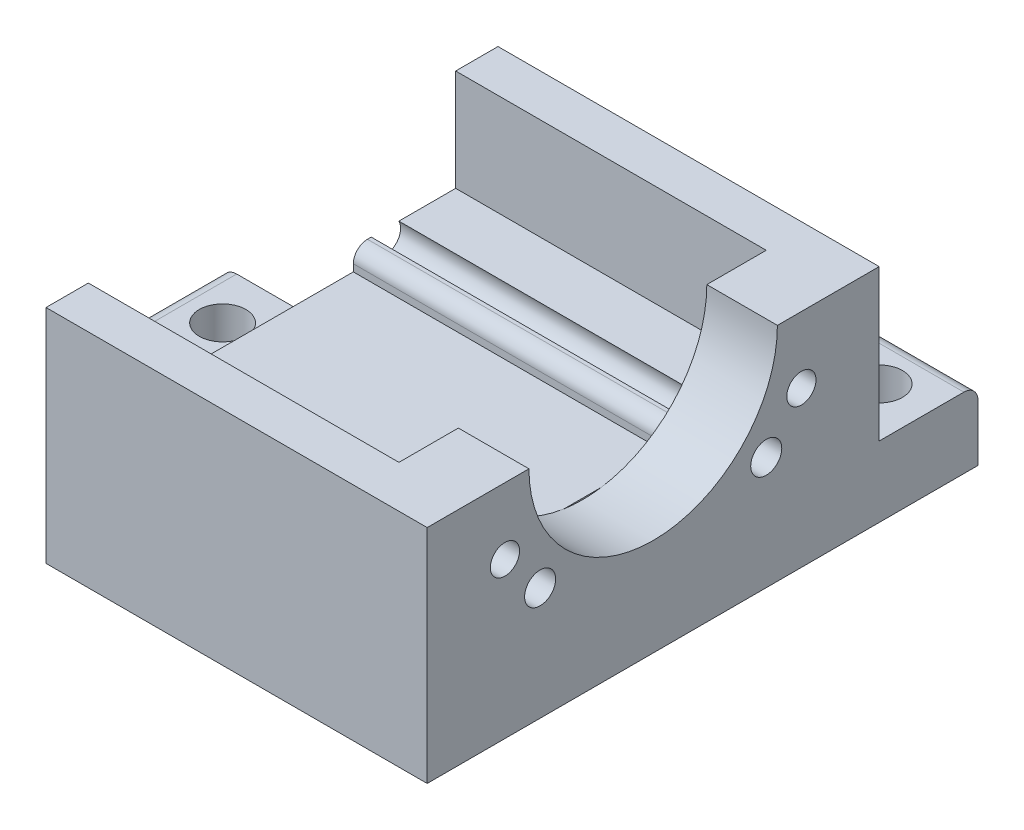
ISO-10303-21;
HEADER;
FILE_DESCRIPTION(('STEP AP214'),'2;1');
FILE_NAME('part.step','',(''),(''),'','','');
FILE_SCHEMA(('AUTOMOTIVE_DESIGN { 1 0 10303 214 1 1 1 1 }'));
ENDSEC;
DATA;
#1=APPLICATION_CONTEXT('core data for automotive mechanical design processes');
#2=APPLICATION_PROTOCOL_DEFINITION('international standard','automotive_design',2000,#1);
#3=PRODUCT_CONTEXT('',#1,'mechanical');
#4=PRODUCT('Part','Part','',(#3));
#5=PRODUCT_RELATED_PRODUCT_CATEGORY('part','',(#4));
#6=PRODUCT_DEFINITION_FORMATION('','',#4);
#7=PRODUCT_DEFINITION_CONTEXT('part definition',#1,'design');
#8=PRODUCT_DEFINITION('design','',#6,#7);
#9=PRODUCT_DEFINITION_SHAPE('','',#8);
#10=(LENGTH_UNIT() NAMED_UNIT(*) SI_UNIT(.MILLI.,.METRE.));
#11=(NAMED_UNIT(*) PLANE_ANGLE_UNIT() SI_UNIT($,.RADIAN.));
#12=(NAMED_UNIT(*) SI_UNIT($,.STERADIAN.) SOLID_ANGLE_UNIT());
#13=UNCERTAINTY_MEASURE_WITH_UNIT(LENGTH_MEASURE(1.E-05),#10,'distance_accuracy_value','');
#14=(GEOMETRIC_REPRESENTATION_CONTEXT(3) GLOBAL_UNCERTAINTY_ASSIGNED_CONTEXT((#13)) GLOBAL_UNIT_ASSIGNED_CONTEXT((#10,
#11,#12)) REPRESENTATION_CONTEXT('',''));
#15=CARTESIAN_POINT('',(0.,0.,0.));
#16=DIRECTION('',(0.,0.,1.));
#17=DIRECTION('',(1.,0.,0.));
#18=AXIS2_PLACEMENT_3D('',#15,#16,#17);
#19=CARTESIAN_POINT('',(-11.,15.7,-16.0089));
#20=DIRECTION('',(0.,0.,-1.));
#21=DIRECTION('',(-1.,0.,0.));
#22=AXIS2_PLACEMENT_3D('',#19,#20,#21);
#23=PLANE('',#22);
#24=DIRECTION('',(0.,1.,0.));
#25=VECTOR('',#24,1.);
#26=CARTESIAN_POINT('',(16.,0.,-16.0089));
#27=LINE('',#26,#25);
#28=CARTESIAN_POINT('',(16.,5.,-16.0089));
#29=VERTEX_POINT('',#28);
#30=CARTESIAN_POINT('',(16.,15.7,-16.0089));
#31=VERTEX_POINT('',#30);
#32=EDGE_CURVE('E256',#29,#31,#27,.T.);
#33=ORIENTED_EDGE('',*,*,#32,.F.);
#34=DIRECTION('',(-1.,0.,0.));
#35=VECTOR('',#34,1.);
#36=CARTESIAN_POINT('',(9.,5.,-16.0089));
#37=LINE('',#36,#35);
#38=CARTESIAN_POINT('',(9.,5.,-16.0089));
#39=VERTEX_POINT('',#38);
#40=EDGE_CURVE('E250',#29,#39,#37,.T.);
#41=ORIENTED_EDGE('',*,*,#40,.T.);
#42=DIRECTION('',(0.,-1.,0.));
#43=VECTOR('',#42,1.);
#44=CARTESIAN_POINT('',(9.,5.,-16.0089));
#45=LINE('',#44,#43);
#46=CARTESIAN_POINT('',(9.,0.,-16.0089));
#47=VERTEX_POINT('',#46);
#48=EDGE_CURVE('E232',#39,#47,#45,.T.);
#49=ORIENTED_EDGE('',*,*,#48,.T.);
#50=DIRECTION('',(1.,0.,0.));
#51=VECTOR('',#50,1.);
#52=CARTESIAN_POINT('',(-11.,0.,-16.0089));
#53=LINE('',#52,#51);
#54=CARTESIAN_POINT('',(-11.,0.,-16.0089));
#55=VERTEX_POINT('',#54);
#56=EDGE_CURVE('E379',#55,#47,#53,.T.);
#57=ORIENTED_EDGE('',*,*,#56,.F.);
#58=DIRECTION('',(0.,-1.,0.));
#59=VECTOR('',#58,1.);
#60=CARTESIAN_POINT('',(-11.,15.7,-16.0089));
#61=LINE('',#60,#59);
#62=CARTESIAN_POINT('',(-11.,15.7,-16.0089));
#63=VERTEX_POINT('',#62);
#64=EDGE_CURVE('E393',#63,#55,#61,.T.);
#65=ORIENTED_EDGE('',*,*,#64,.F.);
#66=DIRECTION('',(1.,0.,0.));
#67=VECTOR('',#66,1.);
#68=CARTESIAN_POINT('',(-11.,15.7,-16.0089));
#69=LINE('',#68,#67);
#70=EDGE_CURVE('E388',#63,#31,#69,.T.);
#71=ORIENTED_EDGE('',*,*,#70,.T.);
#72=EDGE_LOOP('',(#33,#41,#49,#57,#65,#71));
#73=FACE_BOUND('',#72,.T.);
#74=ADVANCED_FACE('F35',(#73),#23,.T.);
#75=CARTESIAN_POINT('',(-11.,0.,0.));
#76=DIRECTION('',(1.,0.,0.));
#77=DIRECTION('',(0.,0.,-1.));
#78=AXIS2_PLACEMENT_3D('',#75,#76,#77);
#79=PLANE('',#78);
#80=DIRECTION('',(0.,0.,1.));
#81=VECTOR('',#80,1.);
#82=CARTESIAN_POINT('',(-11.,8.5,5.7589));
#83=LINE('',#82,#81);
#84=CARTESIAN_POINT('',(-11.,8.5,6.7589));
#85=VERTEX_POINT('',#84);
#86=CARTESIAN_POINT('',(-11.,8.5,7.02910410288673));
#87=VERTEX_POINT('',#86);
#88=EDGE_CURVE('E436',#85,#87,#83,.T.);
#89=ORIENTED_EDGE('',*,*,#88,.F.);
#90=CARTESIAN_POINT('',(-11.,7.5,6.7589));
#91=DIRECTION('',(1.,0.,0.));
#92=DIRECTION('',(0.,0.,-1.));
#93=AXIS2_PLACEMENT_3D('',#90,#91,#92);
#94=CIRCLE('',#93,1.);
#95=CARTESIAN_POINT('',(-11.,7.5,5.7589));
#96=VERTEX_POINT('',#95);
#97=EDGE_CURVE('E459',#85,#96,#94,.F.);
#98=ORIENTED_EDGE('',*,*,#97,.T.);
#99=DIRECTION('',(0.,1.,0.));
#100=VECTOR('',#99,1.);
#101=CARTESIAN_POINT('',(-11.,7.,5.7589));
#102=LINE('',#101,#100);
#103=CARTESIAN_POINT('',(-11.,7.,5.7589));
#104=VERTEX_POINT('',#103);
#105=EDGE_CURVE('E432',#104,#96,#102,.T.);
#106=ORIENTED_EDGE('',*,*,#105,.F.);
#107=DIRECTION('',(0.,0.,1.));
#108=VECTOR('',#107,1.);
#109=CARTESIAN_POINT('',(-11.,7.,-5.7589));
#110=LINE('',#109,#108);
#111=CARTESIAN_POINT('',(-11.,7.,-5.7589));
#112=VERTEX_POINT('',#111);
#113=EDGE_CURVE('E430',#112,#104,#110,.T.);
#114=ORIENTED_EDGE('',*,*,#113,.F.);
#115=DIRECTION('',(0.,-1.,0.));
#116=VECTOR('',#115,1.);
#117=CARTESIAN_POINT('',(-11.,8.5,-5.7589));
#118=LINE('',#117,#116);
#119=CARTESIAN_POINT('',(-11.,7.5,-5.7589));
#120=VERTEX_POINT('',#119);
#121=EDGE_CURVE('E428',#120,#112,#118,.T.);
#122=ORIENTED_EDGE('',*,*,#121,.F.);
#123=CARTESIAN_POINT('',(-11.,7.5,-6.7589));
#124=DIRECTION('',(1.,0.,0.));
#125=DIRECTION('',(0.,0.,-1.));
#126=AXIS2_PLACEMENT_3D('',#123,#124,#125);
#127=CIRCLE('',#126,1.);
#128=CARTESIAN_POINT('',(-11.,8.5,-6.7589));
#129=VERTEX_POINT('',#128);
#130=EDGE_CURVE('E457',#120,#129,#127,.F.);
#131=ORIENTED_EDGE('',*,*,#130,.T.);
#132=DIRECTION('',(0.,0.,1.));
#133=VECTOR('',#132,1.);
#134=CARTESIAN_POINT('',(-11.,8.5,-13.0089));
#135=LINE('',#134,#133);
#136=CARTESIAN_POINT('',(-11.,8.5,-7.02910410288673));
#137=VERTEX_POINT('',#136);
#138=EDGE_CURVE('E424',#137,#129,#135,.T.);
#139=ORIENTED_EDGE('',*,*,#138,.F.);
#140=CARTESIAN_POINT('',(-11.,8.,-8.0089));
#141=DIRECTION('',(1.,0.,0.));
#142=DIRECTION('',(0.,0.,1.));
#143=AXIS2_PLACEMENT_3D('',#140,#141,#142);
#144=CIRCLE('',#143,1.1);
#145=CARTESIAN_POINT('',(-11.,8.5,-8.98869589711327));
#146=VERTEX_POINT('',#145);
#147=EDGE_CURVE('E302',#137,#146,#144,.T.);
#148=ORIENTED_EDGE('',*,*,#147,.T.);
#149=CARTESIAN_POINT('',(-11.,8.5,-13.0089));
#150=VERTEX_POINT('',#149);
#151=EDGE_CURVE('E425',#150,#146,#135,.T.);
#152=ORIENTED_EDGE('',*,*,#151,.F.);
#153=DIRECTION('',(0.,-1.,0.));
#154=VECTOR('',#153,1.);
#155=CARTESIAN_POINT('',(-11.,15.7,-13.0089));
#156=LINE('',#155,#154);
#157=CARTESIAN_POINT('',(-11.,15.7,-13.0089));
#158=VERTEX_POINT('',#157);
#159=EDGE_CURVE('E395',#158,#150,#156,.T.);
#160=ORIENTED_EDGE('',*,*,#159,.F.);
#161=DIRECTION('',(0.,0.,-1.));
#162=VECTOR('',#161,1.);
#163=CARTESIAN_POINT('',(-11.,15.7,-13.0089));
#164=LINE('',#163,#162);
#165=EDGE_CURVE('E385',#158,#63,#164,.T.);
#166=ORIENTED_EDGE('',*,*,#165,.T.);
#167=ORIENTED_EDGE('',*,*,#64,.T.);
#168=DIRECTION('',(0.,0.,-1.));
#169=VECTOR('',#168,1.);
#170=CARTESIAN_POINT('',(-11.,0.,13.0089));
#171=LINE('',#170,#169);
#172=CARTESIAN_POINT('',(-11.,0.,-3.5));
#173=VERTEX_POINT('',#172);
#174=EDGE_CURVE('E397',#173,#55,#171,.T.);
#175=ORIENTED_EDGE('',*,*,#174,.F.);
#176=DIRECTION('',(0.,-1.,0.));
#177=VECTOR('',#176,1.);
#178=CARTESIAN_POINT('',(-11.,5.,-3.5));
#179=LINE('',#178,#177);
#180=CARTESIAN_POINT('',(-11.,5.,-3.5));
#181=VERTEX_POINT('',#180);
#182=EDGE_CURVE('E288',#181,#173,#179,.T.);
#183=ORIENTED_EDGE('',*,*,#182,.F.);
#184=DIRECTION('',(0.,0.,1.));
#185=VECTOR('',#184,1.);
#186=CARTESIAN_POINT('',(-11.,5.,3.5));
#187=LINE('',#186,#185);
#188=CARTESIAN_POINT('',(-11.,5.,3.5));
#189=VERTEX_POINT('',#188);
#190=EDGE_CURVE('E272',#181,#189,#187,.T.);
#191=ORIENTED_EDGE('',*,*,#190,.T.);
#192=DIRECTION('',(0.,-1.,0.));
#193=VECTOR('',#192,1.);
#194=CARTESIAN_POINT('',(-11.,5.,3.5));
#195=LINE('',#194,#193);
#196=CARTESIAN_POINT('',(-11.,0.,3.5));
#197=VERTEX_POINT('',#196);
#198=EDGE_CURVE('E280',#189,#197,#195,.T.);
#199=ORIENTED_EDGE('',*,*,#198,.T.);
#200=CARTESIAN_POINT('',(-11.,0.,16.0089));
#201=VERTEX_POINT('',#200);
#202=EDGE_CURVE('E421',#201,#197,#171,.T.);
#203=ORIENTED_EDGE('',*,*,#202,.F.);
#204=DIRECTION('',(0.,-1.,0.));
#205=VECTOR('',#204,1.);
#206=CARTESIAN_POINT('',(-11.,15.7,16.0089));
#207=LINE('',#206,#205);
#208=CARTESIAN_POINT('',(-11.,15.7,16.0089));
#209=VERTEX_POINT('',#208);
#210=EDGE_CURVE('E376',#209,#201,#207,.T.);
#211=ORIENTED_EDGE('',*,*,#210,.F.);
#212=DIRECTION('',(0.,0.,-1.));
#213=VECTOR('',#212,1.);
#214=CARTESIAN_POINT('',(-11.,15.7,13.0089));
#215=LINE('',#214,#213);
#216=CARTESIAN_POINT('',(-11.,15.7,13.0089));
#217=VERTEX_POINT('',#216);
#218=EDGE_CURVE('E365',#209,#217,#215,.T.);
#219=ORIENTED_EDGE('',*,*,#218,.T.);
#220=DIRECTION('',(0.,-1.,0.));
#221=VECTOR('',#220,1.);
#222=CARTESIAN_POINT('',(-11.,15.7,13.0089));
#223=LINE('',#222,#221);
#224=CARTESIAN_POINT('',(-11.,8.5,13.0089));
#225=VERTEX_POINT('',#224);
#226=EDGE_CURVE('E373',#217,#225,#223,.T.);
#227=ORIENTED_EDGE('',*,*,#226,.T.);
#228=CARTESIAN_POINT('',(-11.,8.5,8.98869589711327));
#229=VERTEX_POINT('',#228);
#230=EDGE_CURVE('E435',#229,#225,#83,.T.);
#231=ORIENTED_EDGE('',*,*,#230,.F.);
#232=CARTESIAN_POINT('',(-11.,8.,8.0089));
#233=DIRECTION('',(1.,0.,0.));
#234=DIRECTION('',(0.,0.,-1.));
#235=AXIS2_PLACEMENT_3D('',#232,#233,#234);
#236=CIRCLE('',#235,1.1);
#237=EDGE_CURVE('E310',#229,#87,#236,.T.);
#238=ORIENTED_EDGE('',*,*,#237,.T.);
#239=EDGE_LOOP('',(#89,#98,#106,#114,#122,#131,#139,#148,#152,#160,#166,#167,#175,#183,#191,
#199,#203,#211,#219,#227,#231,#238));
#240=FACE_BOUND('',#239,.T.);
#241=ADVANCED_FACE('F499',(#240),#79,.F.);
#242=CARTESIAN_POINT('',(11.,8.5,-13.0089));
#243=DIRECTION('',(0.,-1.,0.));
#244=DIRECTION('',(0.,0.,-1.));
#245=AXIS2_PLACEMENT_3D('',#242,#243,#244);
#246=PLANE('',#245);
#247=ORIENTED_EDGE('',*,*,#151,.T.);
#248=DIRECTION('',(1.,0.,0.));
#249=VECTOR('',#248,1.);
#250=CARTESIAN_POINT('',(-11.,8.5,-8.98869589711327));
#251=LINE('',#250,#249);
#252=CARTESIAN_POINT('',(11.,8.5,-8.98869589711327));
#253=VERTEX_POINT('',#252);
#254=EDGE_CURVE('E330',#146,#253,#251,.T.);
#255=ORIENTED_EDGE('',*,*,#254,.T.);
#256=DIRECTION('',(0.,0.,1.));
#257=VECTOR('',#256,1.);
#258=CARTESIAN_POINT('',(11.,8.5,-13.0089));
#259=LINE('',#258,#257);
#260=CARTESIAN_POINT('',(11.,8.5,-13.0089));
#261=VERTEX_POINT('',#260);
#262=EDGE_CURVE('E403',#261,#253,#259,.T.);
#263=ORIENTED_EDGE('',*,*,#262,.F.);
#264=DIRECTION('',(-1.,0.,0.));
#265=VECTOR('',#264,1.);
#266=CARTESIAN_POINT('',(11.,8.5,-13.0089));
#267=LINE('',#266,#265);
#268=EDGE_CURVE('E446',#261,#150,#267,.T.);
#269=ORIENTED_EDGE('',*,*,#268,.T.);
#270=EDGE_LOOP('',(#247,#255,#263,#269));
#271=FACE_BOUND('',#270,.T.);
#272=ADVANCED_FACE('F531',(#271),#246,.F.);
#273=CARTESIAN_POINT('',(11.,8.5,5.7589));
#274=DIRECTION('',(0.,-1.,0.));
#275=DIRECTION('',(0.,0.,-1.));
#276=AXIS2_PLACEMENT_3D('',#273,#274,#275);
#277=PLANE('',#276);
#278=DIRECTION('',(0.,0.,1.));
#279=VECTOR('',#278,1.);
#280=CARTESIAN_POINT('',(11.,8.5,5.7589));
#281=LINE('',#280,#279);
#282=CARTESIAN_POINT('',(11.,8.5,6.7589));
#283=VERTEX_POINT('',#282);
#284=CARTESIAN_POINT('',(11.,8.5,7.02910410288673));
#285=VERTEX_POINT('',#284);
#286=EDGE_CURVE('E418',#283,#285,#281,.T.);
#287=ORIENTED_EDGE('',*,*,#286,.F.);
#288=DIRECTION('',(-1.,0.,0.));
#289=VECTOR('',#288,1.);
#290=CARTESIAN_POINT('',(11.,8.5,6.7589));
#291=LINE('',#290,#289);
#292=EDGE_CURVE('E452',#283,#85,#291,.T.);
#293=ORIENTED_EDGE('',*,*,#292,.T.);
#294=ORIENTED_EDGE('',*,*,#88,.T.);
#295=DIRECTION('',(1.,0.,0.));
#296=VECTOR('',#295,1.);
#297=CARTESIAN_POINT('',(-11.,8.5,7.02910410288673));
#298=LINE('',#297,#296);
#299=EDGE_CURVE('E317',#87,#285,#298,.T.);
#300=ORIENTED_EDGE('',*,*,#299,.T.);
#301=EDGE_LOOP('',(#287,#293,#294,#300));
#302=FACE_BOUND('',#301,.T.);
#303=ADVANCED_FACE('F493',(#302),#277,.F.);
#304=CARTESIAN_POINT('',(11.,0.,0.));
#305=DIRECTION('',(1.,0.,0.));
#306=DIRECTION('',(0.,0.,-1.));
#307=AXIS2_PLACEMENT_3D('',#304,#305,#306);
#308=PLANE('',#307);
#309=CARTESIAN_POINT('',(11.,15.7,0.));
#310=DIRECTION('',(-1.,0.,0.));
#311=DIRECTION('',(0.,0.,-1.));
#312=AXIS2_PLACEMENT_3D('',#309,#310,#311);
#313=CIRCLE('',#312,8.8);
#314=CARTESIAN_POINT('',(11.,7.,-1.32287565553229));
#315=VERTEX_POINT('',#314);
#316=CARTESIAN_POINT('',(11.,7.,1.32287565553229));
#317=VERTEX_POINT('',#316);
#318=EDGE_CURVE('E355',#315,#317,#313,.T.);
#319=ORIENTED_EDGE('',*,*,#318,.F.);
#320=DIRECTION('',(0.,0.,1.));
#321=VECTOR('',#320,1.);
#322=CARTESIAN_POINT('',(11.,7.,-5.7589));
#323=LINE('',#322,#321);
#324=EDGE_CURVE('E414',#315,#317,#323,.T.);
#325=ORIENTED_EDGE('',*,*,#324,.T.);
#326=EDGE_LOOP('',(#319,#325));
#327=FACE_BOUND('',#326,.T.);
#328=ADVANCED_FACE('F589',(#327),#308,.T.);
#329=CARTESIAN_POINT('',(11.,0.,13.0089));
#330=DIRECTION('',(0.,1.,0.));
#331=DIRECTION('',(0.,0.,1.));
#332=AXIS2_PLACEMENT_3D('',#329,#330,#331);
#333=PLANE('',#332);
#334=CARTESIAN_POINT('',(-14.5,0.,0.));
#335=DIRECTION('',(0.,1.,0.));
#336=DIRECTION('',(0.,0.,1.));
#337=AXIS2_PLACEMENT_3D('',#334,#335,#336);
#338=CIRCLE('',#337,1.65);
#339=CARTESIAN_POINT('',(-14.5,0.,1.65));
#340=VERTEX_POINT('',#339);
#341=EDGE_CURVE('E266',#340,#340,#338,.T.);
#342=ORIENTED_EDGE('',*,*,#341,.T.);
#343=EDGE_LOOP('',(#342));
#344=FACE_BOUND('',#343,.T.);
#345=CARTESIAN_POINT('',(12.5,0.,-19.5089));
#346=DIRECTION('',(0.,1.,0.));
#347=DIRECTION('',(0.,0.,1.));
#348=AXIS2_PLACEMENT_3D('',#345,#346,#347);
#349=CIRCLE('',#348,1.65);
#350=CARTESIAN_POINT('',(12.5,0.,-17.8589));
#351=VERTEX_POINT('',#350);
#352=EDGE_CURVE('E962',#351,#351,#349,.T.);
#353=ORIENTED_EDGE('',*,*,#352,.T.);
#354=EDGE_LOOP('',(#353));
#355=FACE_BOUND('',#354,.T.);
#356=ORIENTED_EDGE('',*,*,#202,.T.);
#357=DIRECTION('',(-1.,0.,0.));
#358=VECTOR('',#357,1.);
#359=CARTESIAN_POINT('',(-11.,0.,3.5));
#360=LINE('',#359,#358);
#361=CARTESIAN_POINT('',(-18.,0.,3.5));
#362=VERTEX_POINT('',#361);
#363=EDGE_CURVE('E270',#197,#362,#360,.T.);
#364=ORIENTED_EDGE('',*,*,#363,.T.);
#365=DIRECTION('',(0.,0.,-1.));
#366=VECTOR('',#365,1.);
#367=CARTESIAN_POINT('',(-18.,0.,3.5));
#368=LINE('',#367,#366);
#369=CARTESIAN_POINT('',(-18.,0.,-3.5));
#370=VERTEX_POINT('',#369);
#371=EDGE_CURVE('E283',#362,#370,#368,.T.);
#372=ORIENTED_EDGE('',*,*,#371,.T.);
#373=DIRECTION('',(1.,0.,0.));
#374=VECTOR('',#373,1.);
#375=CARTESIAN_POINT('',(-11.,0.,-3.5));
#376=LINE('',#375,#374);
#377=EDGE_CURVE('E276',#370,#173,#376,.T.);
#378=ORIENTED_EDGE('',*,*,#377,.T.);
#379=ORIENTED_EDGE('',*,*,#174,.T.);
#380=ORIENTED_EDGE('',*,*,#56,.T.);
#381=DIRECTION('',(0.,0.,-1.));
#382=VECTOR('',#381,1.);
#383=CARTESIAN_POINT('',(9.,0.,-23.0089));
#384=LINE('',#383,#382);
#385=CARTESIAN_POINT('',(9.,0.,-23.0089));
#386=VERTEX_POINT('',#385);
#387=EDGE_CURVE('E238',#47,#386,#384,.T.);
#388=ORIENTED_EDGE('',*,*,#387,.T.);
#389=DIRECTION('',(1.,0.,0.));
#390=VECTOR('',#389,1.);
#391=CARTESIAN_POINT('',(16.,0.,-23.0089));
#392=LINE('',#391,#390);
#393=CARTESIAN_POINT('',(16.,0.,-23.0089));
#394=VERTEX_POINT('',#393);
#395=EDGE_CURVE('E257',#386,#394,#392,.T.);
#396=ORIENTED_EDGE('',*,*,#395,.T.);
#397=DIRECTION('',(0.,0.,-1.));
#398=VECTOR('',#397,1.);
#399=CARTESIAN_POINT('',(16.,0.,16.0089));
#400=LINE('',#399,#398);
#401=CARTESIAN_POINT('',(16.,0.,16.0089));
#402=VERTEX_POINT('',#401);
#403=EDGE_CURVE('E344',#402,#394,#400,.T.);
#404=ORIENTED_EDGE('',*,*,#403,.F.);
#405=DIRECTION('',(-1.,0.,0.));
#406=VECTOR('',#405,1.);
#407=CARTESIAN_POINT('',(-11.,0.,16.0089));
#408=LINE('',#407,#406);
#409=EDGE_CURVE('E364',#402,#201,#408,.T.);
#410=ORIENTED_EDGE('',*,*,#409,.T.);
#411=EDGE_LOOP('',(#356,#364,#372,#378,#379,#380,#388,#396,#404,#410));
#412=FACE_BOUND('',#411,.T.);
#413=ADVANCED_FACE('F556',(#344,#355,#412),#333,.F.);
#414=ORIENTED_EDGE('',*,*,#138,.T.);
#415=DIRECTION('',(-1.,0.,0.));
#416=VECTOR('',#415,1.);
#417=CARTESIAN_POINT('',(11.,8.5,-6.7589));
#418=LINE('',#417,#416);
#419=CARTESIAN_POINT('',(11.,8.5,-6.7589));
#420=VERTEX_POINT('',#419);
#421=EDGE_CURVE('E466',#129,#420,#418,.F.);
#422=ORIENTED_EDGE('',*,*,#421,.T.);
#423=CARTESIAN_POINT('',(11.,8.5,-7.02910410288673));
#424=VERTEX_POINT('',#423);
#425=EDGE_CURVE('E407',#424,#420,#259,.T.);
#426=ORIENTED_EDGE('',*,*,#425,.F.);
#427=DIRECTION('',(1.,0.,0.));
#428=VECTOR('',#427,1.);
#429=CARTESIAN_POINT('',(-11.,8.5,-7.02910410288673));
#430=LINE('',#429,#428);
#431=EDGE_CURVE('E327',#424,#137,#430,.F.);
#432=ORIENTED_EDGE('',*,*,#431,.T.);
#433=EDGE_LOOP('',(#414,#422,#426,#432));
#434=FACE_BOUND('',#433,.T.);
#435=ADVANCED_FACE('F524',(#434),#246,.F.);
#436=CARTESIAN_POINT('',(11.,8.5,-5.7589));
#437=DIRECTION('',(0.,0.,-1.));
#438=DIRECTION('',(0.,1.,0.));
#439=AXIS2_PLACEMENT_3D('',#436,#437,#438);
#440=PLANE('',#439);
#441=DIRECTION('',(0.,-1.,0.));
#442=VECTOR('',#441,1.);
#443=CARTESIAN_POINT('',(11.,8.5,-5.7589));
#444=LINE('',#443,#442);
#445=CARTESIAN_POINT('',(11.,7.5,-5.7589));
#446=VERTEX_POINT('',#445);
#447=CARTESIAN_POINT('',(11.,7.,-5.7589));
#448=VERTEX_POINT('',#447);
#449=EDGE_CURVE('E406',#446,#448,#444,.T.);
#450=ORIENTED_EDGE('',*,*,#449,.F.);
#451=DIRECTION('',(-1.,0.,0.));
#452=VECTOR('',#451,1.);
#453=CARTESIAN_POINT('',(11.,7.5,-5.7589));
#454=LINE('',#453,#452);
#455=EDGE_CURVE('E463',#446,#120,#454,.T.);
#456=ORIENTED_EDGE('',*,*,#455,.T.);
#457=ORIENTED_EDGE('',*,*,#121,.T.);
#458=DIRECTION('',(-1.,0.,0.));
#459=VECTOR('',#458,1.);
#460=CARTESIAN_POINT('',(11.,7.,-5.7589));
#461=LINE('',#460,#459);
#462=EDGE_CURVE('E443',#448,#112,#461,.T.);
#463=ORIENTED_EDGE('',*,*,#462,.F.);
#464=EDGE_LOOP('',(#450,#456,#457,#463));
#465=FACE_BOUND('',#464,.T.);
#466=ADVANCED_FACE('F515',(#465),#440,.F.);
#467=CARTESIAN_POINT('',(11.,7.,-5.7589));
#468=DIRECTION('',(0.,-1.,0.));
#469=DIRECTION('',(0.,0.,-1.));
#470=AXIS2_PLACEMENT_3D('',#467,#468,#469);
#471=PLANE('',#470);
#472=ORIENTED_EDGE('',*,*,#113,.T.);
#473=DIRECTION('',(-1.,0.,0.));
#474=VECTOR('',#473,1.);
#475=CARTESIAN_POINT('',(11.,7.,5.7589));
#476=LINE('',#475,#474);
#477=CARTESIAN_POINT('',(11.,7.,5.7589));
#478=VERTEX_POINT('',#477);
#479=EDGE_CURVE('E440',#478,#104,#476,.T.);
#480=ORIENTED_EDGE('',*,*,#479,.F.);
#481=EDGE_CURVE('E409',#317,#478,#323,.T.);
#482=ORIENTED_EDGE('',*,*,#481,.F.);
#483=ORIENTED_EDGE('',*,*,#324,.F.);
#484=EDGE_CURVE('E410',#448,#315,#323,.T.);
#485=ORIENTED_EDGE('',*,*,#484,.F.);
#486=ORIENTED_EDGE('',*,*,#462,.T.);
#487=EDGE_LOOP('',(#472,#480,#482,#483,#485,#486));
#488=FACE_BOUND('',#487,.T.);
#489=ADVANCED_FACE('F505',(#488),#471,.F.);
#490=CARTESIAN_POINT('',(11.,7.,5.7589));
#491=DIRECTION('',(0.,0.,1.));
#492=DIRECTION('',(0.,-1.,0.));
#493=AXIS2_PLACEMENT_3D('',#490,#491,#492);
#494=PLANE('',#493);
#495=ORIENTED_EDGE('',*,*,#105,.T.);
#496=DIRECTION('',(-1.,0.,0.));
#497=VECTOR('',#496,1.);
#498=CARTESIAN_POINT('',(11.,7.5,5.7589));
#499=LINE('',#498,#497);
#500=CARTESIAN_POINT('',(11.,7.5,5.7589));
#501=VERTEX_POINT('',#500);
#502=EDGE_CURVE('E461',#96,#501,#499,.F.);
#503=ORIENTED_EDGE('',*,*,#502,.T.);
#504=DIRECTION('',(0.,1.,0.));
#505=VECTOR('',#504,1.);
#506=CARTESIAN_POINT('',(11.,7.,5.7589));
#507=LINE('',#506,#505);
#508=EDGE_CURVE('E413',#478,#501,#507,.T.);
#509=ORIENTED_EDGE('',*,*,#508,.F.);
#510=ORIENTED_EDGE('',*,*,#479,.T.);
#511=EDGE_LOOP('',(#495,#503,#509,#510));
#512=FACE_BOUND('',#511,.T.);
#513=ADVANCED_FACE('F502',(#512),#494,.F.);
#514=CARTESIAN_POINT('',(11.,8.5,8.98869589711327));
#515=VERTEX_POINT('',#514);
#516=CARTESIAN_POINT('',(11.,8.5,13.0089));
#517=VERTEX_POINT('',#516);
#518=EDGE_CURVE('E417',#515,#517,#281,.T.);
#519=ORIENTED_EDGE('',*,*,#518,.F.);
#520=DIRECTION('',(1.,0.,0.));
#521=VECTOR('',#520,1.);
#522=CARTESIAN_POINT('',(-11.,8.5,8.98869589711327));
#523=LINE('',#522,#521);
#524=EDGE_CURVE('E300',#515,#229,#523,.F.);
#525=ORIENTED_EDGE('',*,*,#524,.T.);
#526=ORIENTED_EDGE('',*,*,#230,.T.);
#527=DIRECTION('',(-1.,0.,0.));
#528=VECTOR('',#527,1.);
#529=CARTESIAN_POINT('',(11.,8.5,13.0089));
#530=LINE('',#529,#528);
#531=EDGE_CURVE('E420',#517,#225,#530,.T.);
#532=ORIENTED_EDGE('',*,*,#531,.F.);
#533=EDGE_LOOP('',(#519,#525,#526,#532));
#534=FACE_BOUND('',#533,.T.);
#535=ADVANCED_FACE('F593',(#534),#277,.F.);
#536=CARTESIAN_POINT('',(-11.,15.7,-13.0089));
#537=DIRECTION('',(0.,0.,1.));
#538=DIRECTION('',(1.,0.,0.));
#539=AXIS2_PLACEMENT_3D('',#536,#537,#538);
#540=PLANE('',#539);
#541=ORIENTED_EDGE('',*,*,#268,.F.);
#542=DIRECTION('',(0.,-1.,0.));
#543=VECTOR('',#542,1.);
#544=CARTESIAN_POINT('',(11.,15.7,-13.0089));
#545=LINE('',#544,#543);
#546=CARTESIAN_POINT('',(11.,15.7,-13.0089));
#547=VERTEX_POINT('',#546);
#548=EDGE_CURVE('E398',#547,#261,#545,.T.);
#549=ORIENTED_EDGE('',*,*,#548,.F.);
#550=DIRECTION('',(-1.,0.,0.));
#551=VECTOR('',#550,1.);
#552=CARTESIAN_POINT('',(-11.,15.7,-13.0089));
#553=LINE('',#552,#551);
#554=EDGE_CURVE('E390',#547,#158,#553,.T.);
#555=ORIENTED_EDGE('',*,*,#554,.T.);
#556=ORIENTED_EDGE('',*,*,#159,.T.);
#557=EDGE_LOOP('',(#541,#549,#555,#556));
#558=FACE_BOUND('',#557,.T.);
#559=ADVANCED_FACE('F541',(#558),#540,.T.);
#560=CARTESIAN_POINT('',(0.,15.7,0.));
#561=DIRECTION('',(0.,-1.,0.));
#562=DIRECTION('',(0.,0.,-1.));
#563=AXIS2_PLACEMENT_3D('',#560,#561,#562);
#564=PLANE('',#563);
#565=ORIENTED_EDGE('',*,*,#165,.F.);
#566=ORIENTED_EDGE('',*,*,#554,.F.);
#567=DIRECTION('',(0.,0.,1.));
#568=VECTOR('',#567,1.);
#569=CARTESIAN_POINT('',(11.,15.7,-16.0089));
#570=LINE('',#569,#568);
#571=CARTESIAN_POINT('',(11.,15.7,-8.8));
#572=VERTEX_POINT('',#571);
#573=EDGE_CURVE('E338',#547,#572,#570,.T.);
#574=ORIENTED_EDGE('',*,*,#573,.T.);
#575=DIRECTION('',(-1.,0.,0.));
#576=VECTOR('',#575,1.);
#577=CARTESIAN_POINT('',(16.,15.7,-8.8));
#578=LINE('',#577,#576);
#579=CARTESIAN_POINT('',(16.,15.7,-8.8));
#580=VERTEX_POINT('',#579);
#581=EDGE_CURVE('E350',#580,#572,#578,.T.);
#582=ORIENTED_EDGE('',*,*,#581,.F.);
#583=DIRECTION('',(0.,0.,1.));
#584=VECTOR('',#583,1.);
#585=CARTESIAN_POINT('',(16.,15.7,-16.0089));
#586=LINE('',#585,#584);
#587=EDGE_CURVE('E348',#31,#580,#586,.T.);
#588=ORIENTED_EDGE('',*,*,#587,.F.);
#589=ORIENTED_EDGE('',*,*,#70,.F.);
#590=EDGE_LOOP('',(#565,#566,#574,#582,#588,#589));
#591=FACE_BOUND('',#590,.T.);
#592=ADVANCED_FACE('F538',(#591),#564,.F.);
#593=CARTESIAN_POINT('',(-11.,15.7,16.0089));
#594=DIRECTION('',(0.,0.,1.));
#595=DIRECTION('',(1.,0.,0.));
#596=AXIS2_PLACEMENT_3D('',#593,#594,#595);
#597=PLANE('',#596);
#598=ORIENTED_EDGE('',*,*,#409,.F.);
#599=DIRECTION('',(0.,-1.,0.));
#600=VECTOR('',#599,1.);
#601=CARTESIAN_POINT('',(16.,15.7,16.0089));
#602=LINE('',#601,#600);
#603=CARTESIAN_POINT('',(16.,15.7,16.0089));
#604=VERTEX_POINT('',#603);
#605=EDGE_CURVE('E341',#604,#402,#602,.T.);
#606=ORIENTED_EDGE('',*,*,#605,.F.);
#607=DIRECTION('',(-1.,0.,0.));
#608=VECTOR('',#607,1.);
#609=CARTESIAN_POINT('',(-11.,15.7,16.0089));
#610=LINE('',#609,#608);
#611=EDGE_CURVE('E370',#604,#209,#610,.T.);
#612=ORIENTED_EDGE('',*,*,#611,.T.);
#613=ORIENTED_EDGE('',*,*,#210,.T.);
#614=EDGE_LOOP('',(#598,#606,#612,#613));
#615=FACE_BOUND('',#614,.T.);
#616=ADVANCED_FACE('F565',(#615),#597,.T.);
#617=CARTESIAN_POINT('',(-11.,15.7,13.0089));
#618=DIRECTION('',(0.,0.,-1.));
#619=DIRECTION('',(-1.,0.,0.));
#620=AXIS2_PLACEMENT_3D('',#617,#618,#619);
#621=PLANE('',#620);
#622=DIRECTION('',(0.,-1.,0.));
#623=VECTOR('',#622,1.);
#624=CARTESIAN_POINT('',(11.,15.7,13.0089));
#625=LINE('',#624,#623);
#626=CARTESIAN_POINT('',(11.,15.7,13.0089));
#627=VERTEX_POINT('',#626);
#628=EDGE_CURVE('E380',#627,#517,#625,.T.);
#629=ORIENTED_EDGE('',*,*,#628,.T.);
#630=ORIENTED_EDGE('',*,*,#531,.T.);
#631=ORIENTED_EDGE('',*,*,#226,.F.);
#632=DIRECTION('',(1.,0.,0.));
#633=VECTOR('',#632,1.);
#634=CARTESIAN_POINT('',(-11.,15.7,13.0089));
#635=LINE('',#634,#633);
#636=EDGE_CURVE('E368',#217,#627,#635,.T.);
#637=ORIENTED_EDGE('',*,*,#636,.T.);
#638=EDGE_LOOP('',(#629,#630,#631,#637));
#639=FACE_BOUND('',#638,.T.);
#640=ADVANCED_FACE('F669',(#639),#621,.T.);
#641=CARTESIAN_POINT('',(0.,15.7,0.));
#642=DIRECTION('',(0.,1.,0.));
#643=DIRECTION('',(0.,0.,1.));
#644=AXIS2_PLACEMENT_3D('',#641,#642,#643);
#645=PLANE('',#644);
#646=ORIENTED_EDGE('',*,*,#218,.F.);
#647=ORIENTED_EDGE('',*,*,#611,.F.);
#648=DIRECTION('',(0.,0.,1.));
#649=VECTOR('',#648,1.);
#650=CARTESIAN_POINT('',(16.,15.7,8.8));
#651=LINE('',#650,#649);
#652=CARTESIAN_POINT('',(16.,15.7,8.8));
#653=VERTEX_POINT('',#652);
#654=EDGE_CURVE('E337',#653,#604,#651,.T.);
#655=ORIENTED_EDGE('',*,*,#654,.F.);
#656=DIRECTION('',(-1.,0.,0.));
#657=VECTOR('',#656,1.);
#658=CARTESIAN_POINT('',(16.,15.7,8.8));
#659=LINE('',#658,#657);
#660=CARTESIAN_POINT('',(11.,15.7,8.8));
#661=VERTEX_POINT('',#660);
#662=EDGE_CURVE('E361',#653,#661,#659,.T.);
#663=ORIENTED_EDGE('',*,*,#662,.T.);
#664=DIRECTION('',(0.,0.,1.));
#665=VECTOR('',#664,1.);
#666=CARTESIAN_POINT('',(11.,15.7,8.8));
#667=LINE('',#666,#665);
#668=EDGE_CURVE('E354',#661,#627,#667,.T.);
#669=ORIENTED_EDGE('',*,*,#668,.T.);
#670=ORIENTED_EDGE('',*,*,#636,.F.);
#671=EDGE_LOOP('',(#646,#647,#655,#663,#669,#670));
#672=FACE_BOUND('',#671,.T.);
#673=ADVANCED_FACE('F666',(#672),#645,.T.);
#674=CARTESIAN_POINT('',(11.,15.7,0.));
#675=DIRECTION('',(1.,0.,0.));
#676=DIRECTION('',(0.,0.,-1.));
#677=AXIS2_PLACEMENT_3D('',#674,#675,#676);
#678=PLANE('',#677);
#679=CARTESIAN_POINT('',(11.,11.,-10.5));
#680=DIRECTION('',(1.,0.,0.));
#681=DIRECTION('',(0.,0.,-1.));
#682=AXIS2_PLACEMENT_3D('',#679,#680,#681);
#683=CIRCLE('',#682,1.035);
#684=CARTESIAN_POINT('',(11.,11.,-11.535));
#685=VERTEX_POINT('',#684);
#686=EDGE_CURVE('E321',#685,#685,#683,.T.);
#687=ORIENTED_EDGE('',*,*,#686,.T.);
#688=EDGE_LOOP('',(#687));
#689=FACE_BOUND('',#688,.T.);
#690=ORIENTED_EDGE('',*,*,#262,.T.);
#691=CARTESIAN_POINT('',(11.,8.,-8.0089));
#692=DIRECTION('',(1.,0.,0.));
#693=DIRECTION('',(0.,0.,-1.));
#694=AXIS2_PLACEMENT_3D('',#691,#692,#693);
#695=CIRCLE('',#694,1.1);
#696=EDGE_CURVE('E324',#253,#424,#695,.T.);
#697=ORIENTED_EDGE('',*,*,#696,.T.);
#698=ORIENTED_EDGE('',*,*,#425,.T.);
#699=CARTESIAN_POINT('',(11.,7.5,-6.7589));
#700=DIRECTION('',(1.,0.,0.));
#701=DIRECTION('',(0.,0.,-1.));
#702=AXIS2_PLACEMENT_3D('',#699,#700,#701);
#703=CIRCLE('',#702,1.);
#704=EDGE_CURVE('E11',#420,#446,#703,.T.);
#705=ORIENTED_EDGE('',*,*,#704,.T.);
#706=ORIENTED_EDGE('',*,*,#449,.T.);
#707=ORIENTED_EDGE('',*,*,#484,.T.);
#708=EDGE_CURVE('E351',#572,#315,#313,.T.);
#709=ORIENTED_EDGE('',*,*,#708,.F.);
#710=ORIENTED_EDGE('',*,*,#573,.F.);
#711=ORIENTED_EDGE('',*,*,#548,.T.);
#712=EDGE_LOOP('',(#690,#697,#698,#705,#706,#707,#709,#710,#711));
#713=FACE_BOUND('',#712,.T.);
#714=ADVANCED_FACE('F526',(#689,#713),#678,.F.);
#715=CARTESIAN_POINT('',(16.,15.7,0.));
#716=DIRECTION('',(-1.,0.,0.));
#717=DIRECTION('',(0.,0.,1.));
#718=AXIS2_PLACEMENT_3D('',#715,#716,#717);
#719=CYLINDRICAL_SURFACE('',#718,8.8);
#720=ORIENTED_EDGE('',*,*,#708,.T.);
#721=ORIENTED_EDGE('',*,*,#318,.T.);
#722=EDGE_CURVE('E333',#317,#661,#313,.T.);
#723=ORIENTED_EDGE('',*,*,#722,.T.);
#724=ORIENTED_EDGE('',*,*,#662,.F.);
#725=CARTESIAN_POINT('',(16.,15.7,0.));
#726=DIRECTION('',(-1.,0.,0.));
#727=DIRECTION('',(0.,0.,-1.));
#728=AXIS2_PLACEMENT_3D('',#725,#726,#727);
#729=CIRCLE('',#728,8.8);
#730=EDGE_CURVE('E334',#580,#653,#729,.T.);
#731=ORIENTED_EDGE('',*,*,#730,.F.);
#732=ORIENTED_EDGE('',*,*,#581,.T.);
#733=EDGE_LOOP('',(#720,#721,#723,#724,#731,#732));
#734=FACE_BOUND('',#733,.T.);
#735=ADVANCED_FACE('F546',(#734),#719,.F.);
#736=CARTESIAN_POINT('',(16.,15.7,0.));
#737=DIRECTION('',(1.,0.,0.));
#738=DIRECTION('',(0.,0.,-1.));
#739=AXIS2_PLACEMENT_3D('',#736,#737,#738);
#740=PLANE('',#739);
#741=CARTESIAN_POINT('',(16.,11.,10.5));
#742=DIRECTION('',(1.,0.,0.));
#743=DIRECTION('',(0.,0.,-1.));
#744=AXIS2_PLACEMENT_3D('',#741,#742,#743);
#745=CIRCLE('',#744,1.035);
#746=CARTESIAN_POINT('',(16.,11.,9.465));
#747=VERTEX_POINT('',#746);
#748=EDGE_CURVE('E297',#747,#747,#745,.T.);
#749=ORIENTED_EDGE('',*,*,#748,.F.);
#750=EDGE_LOOP('',(#749));
#751=FACE_BOUND('',#750,.T.);
#752=CARTESIAN_POINT('',(16.,8.,-8.0089));
#753=DIRECTION('',(1.,0.,0.));
#754=DIRECTION('',(0.,0.,1.));
#755=AXIS2_PLACEMENT_3D('',#752,#753,#754);
#756=CIRCLE('',#755,1.1);
#757=CARTESIAN_POINT('',(16.,8.,-6.9089));
#758=VERTEX_POINT('',#757);
#759=EDGE_CURVE('E290',#758,#758,#756,.T.);
#760=ORIENTED_EDGE('',*,*,#759,.F.);
#761=EDGE_LOOP('',(#760));
#762=FACE_BOUND('',#761,.T.);
#763=CARTESIAN_POINT('',(16.,8.,8.0089));
#764=DIRECTION('',(1.,0.,0.));
#765=DIRECTION('',(0.,0.,-1.));
#766=AXIS2_PLACEMENT_3D('',#763,#764,#765);
#767=CIRCLE('',#766,1.1);
#768=CARTESIAN_POINT('',(16.,8.,6.9089));
#769=VERTEX_POINT('',#768);
#770=EDGE_CURVE('E305',#769,#769,#767,.T.);
#771=ORIENTED_EDGE('',*,*,#770,.F.);
#772=EDGE_LOOP('',(#771));
#773=FACE_BOUND('',#772,.T.);
#774=CARTESIAN_POINT('',(16.,11.,-10.5));
#775=DIRECTION('',(1.,0.,0.));
#776=DIRECTION('',(0.,0.,1.));
#777=AXIS2_PLACEMENT_3D('',#774,#775,#776);
#778=CIRCLE('',#777,1.035);
#779=CARTESIAN_POINT('',(16.,11.,-9.465));
#780=VERTEX_POINT('',#779);
#781=EDGE_CURVE('E301',#780,#780,#778,.T.);
#782=ORIENTED_EDGE('',*,*,#781,.F.);
#783=EDGE_LOOP('',(#782));
#784=FACE_BOUND('',#783,.T.);
#785=DIRECTION('',(0.,-1.,0.));
#786=VECTOR('',#785,1.);
#787=CARTESIAN_POINT('',(16.,5.,-23.0089));
#788=LINE('',#787,#786);
#789=CARTESIAN_POINT('',(16.,4.,-23.0089));
#790=VERTEX_POINT('',#789);
#791=EDGE_CURVE('E268',#790,#394,#788,.T.);
#792=ORIENTED_EDGE('',*,*,#791,.F.);
#793=CARTESIAN_POINT('',(16.,4.,-22.0089));
#794=DIRECTION('',(1.,0.,0.));
#795=DIRECTION('',(0.,0.,-1.));
#796=AXIS2_PLACEMENT_3D('',#793,#794,#795);
#797=CIRCLE('',#796,1.);
#798=CARTESIAN_POINT('',(16.,5.,-22.0089));
#799=VERTEX_POINT('',#798);
#800=EDGE_CURVE('E471',#790,#799,#797,.T.);
#801=ORIENTED_EDGE('',*,*,#800,.T.);
#802=DIRECTION('',(0.,0.,1.));
#803=VECTOR('',#802,1.);
#804=CARTESIAN_POINT('',(16.,5.,-16.0089));
#805=LINE('',#804,#803);
#806=EDGE_CURVE('E244',#799,#29,#805,.T.);
#807=ORIENTED_EDGE('',*,*,#806,.T.);
#808=ORIENTED_EDGE('',*,*,#32,.T.);
#809=ORIENTED_EDGE('',*,*,#587,.T.);
#810=ORIENTED_EDGE('',*,*,#730,.T.);
#811=ORIENTED_EDGE('',*,*,#654,.T.);
#812=ORIENTED_EDGE('',*,*,#605,.T.);
#813=ORIENTED_EDGE('',*,*,#403,.T.);
#814=EDGE_LOOP('',(#792,#801,#807,#808,#809,#810,#811,#812,#813));
#815=FACE_BOUND('',#814,.T.);
#816=ADVANCED_FACE('F551',(#751,#762,#773,#784,#815),#740,.T.);
#817=CARTESIAN_POINT('',(11.,11.,10.5));
#818=DIRECTION('',(1.,0.,0.));
#819=DIRECTION('',(0.,0.,-1.));
#820=AXIS2_PLACEMENT_3D('',#817,#818,#819);
#821=CIRCLE('',#820,1.035);
#822=CARTESIAN_POINT('',(11.,11.,9.465));
#823=VERTEX_POINT('',#822);
#824=EDGE_CURVE('E320',#823,#823,#821,.T.);
#825=ORIENTED_EDGE('',*,*,#824,.T.);
#826=EDGE_LOOP('',(#825));
#827=FACE_BOUND('',#826,.T.);
#828=ORIENTED_EDGE('',*,*,#508,.T.);
#829=CARTESIAN_POINT('',(11.,7.5,6.7589));
#830=DIRECTION('',(1.,0.,0.));
#831=DIRECTION('',(0.,0.,-1.));
#832=AXIS2_PLACEMENT_3D('',#829,#830,#831);
#833=CIRCLE('',#832,1.);
#834=EDGE_CURVE('E43',#501,#283,#833,.T.);
#835=ORIENTED_EDGE('',*,*,#834,.T.);
#836=ORIENTED_EDGE('',*,*,#286,.T.);
#837=CARTESIAN_POINT('',(11.,8.,8.0089));
#838=DIRECTION('',(1.,0.,0.));
#839=DIRECTION('',(0.,0.,-1.));
#840=AXIS2_PLACEMENT_3D('',#837,#838,#839);
#841=CIRCLE('',#840,1.1);
#842=EDGE_CURVE('E449',#285,#515,#841,.T.);
#843=ORIENTED_EDGE('',*,*,#842,.T.);
#844=ORIENTED_EDGE('',*,*,#518,.T.);
#845=ORIENTED_EDGE('',*,*,#628,.F.);
#846=ORIENTED_EDGE('',*,*,#668,.F.);
#847=ORIENTED_EDGE('',*,*,#722,.F.);
#848=ORIENTED_EDGE('',*,*,#481,.T.);
#849=EDGE_LOOP('',(#828,#835,#836,#843,#844,#845,#846,#847,#848));
#850=FACE_BOUND('',#849,.T.);
#851=ADVANCED_FACE('F485',(#827,#850),#678,.F.);
#852=CARTESIAN_POINT('',(-11.,8.,8.0089));
#853=DIRECTION('',(1.,0.,0.));
#854=DIRECTION('',(0.,0.,-1.));
#855=AXIS2_PLACEMENT_3D('',#852,#853,#854);
#856=CYLINDRICAL_SURFACE('',#855,1.1);
#857=ORIENTED_EDGE('',*,*,#770,.T.);
#858=EDGE_LOOP('',(#857));
#859=FACE_BOUND('',#858,.T.);
#860=ORIENTED_EDGE('',*,*,#237,.F.);
#861=ORIENTED_EDGE('',*,*,#524,.F.);
#862=ORIENTED_EDGE('',*,*,#842,.F.);
#863=ORIENTED_EDGE('',*,*,#299,.F.);
#864=EDGE_LOOP('',(#860,#861,#862,#863));
#865=FACE_BOUND('',#864,.T.);
#866=ADVANCED_FACE('F647',(#859,#865),#856,.F.);
#867=CARTESIAN_POINT('',(-11.,11.,10.5));
#868=DIRECTION('',(1.,0.,0.));
#869=DIRECTION('',(0.,0.,-1.));
#870=AXIS2_PLACEMENT_3D('',#867,#868,#869);
#871=CYLINDRICAL_SURFACE('',#870,1.035);
#872=ORIENTED_EDGE('',*,*,#748,.T.);
#873=EDGE_LOOP('',(#872));
#874=FACE_BOUND('',#873,.T.);
#875=ORIENTED_EDGE('',*,*,#824,.F.);
#876=EDGE_LOOP('',(#875));
#877=FACE_BOUND('',#876,.T.);
#878=ADVANCED_FACE('F643',(#874,#877),#871,.F.);
#879=CARTESIAN_POINT('',(-11.,11.,-10.5));
#880=DIRECTION('',(1.,0.,0.));
#881=DIRECTION('',(0.,0.,-1.));
#882=AXIS2_PLACEMENT_3D('',#879,#880,#881);
#883=CYLINDRICAL_SURFACE('',#882,1.035);
#884=ORIENTED_EDGE('',*,*,#781,.T.);
#885=EDGE_LOOP('',(#884));
#886=FACE_BOUND('',#885,.T.);
#887=ORIENTED_EDGE('',*,*,#686,.F.);
#888=EDGE_LOOP('',(#887));
#889=FACE_BOUND('',#888,.T.);
#890=ADVANCED_FACE('F646',(#886,#889),#883,.F.);
#891=CARTESIAN_POINT('',(-11.,8.,-8.0089));
#892=DIRECTION('',(1.,0.,0.));
#893=DIRECTION('',(0.,0.,-1.));
#894=AXIS2_PLACEMENT_3D('',#891,#892,#893);
#895=CYLINDRICAL_SURFACE('',#894,1.1);
#896=ORIENTED_EDGE('',*,*,#759,.T.);
#897=EDGE_LOOP('',(#896));
#898=FACE_BOUND('',#897,.T.);
#899=ORIENTED_EDGE('',*,*,#147,.F.);
#900=ORIENTED_EDGE('',*,*,#431,.F.);
#901=ORIENTED_EDGE('',*,*,#696,.F.);
#902=ORIENTED_EDGE('',*,*,#254,.F.);
#903=EDGE_LOOP('',(#899,#900,#901,#902));
#904=FACE_BOUND('',#903,.T.);
#905=ADVANCED_FACE('F529',(#898,#904),#895,.F.);
#906=CARTESIAN_POINT('',(-11.,5.,-3.5));
#907=DIRECTION('',(0.,0.,-1.));
#908=DIRECTION('',(-1.,0.,0.));
#909=AXIS2_PLACEMENT_3D('',#906,#907,#908);
#910=PLANE('',#909);
#911=DIRECTION('',(0.,-1.,0.));
#912=VECTOR('',#911,1.);
#913=CARTESIAN_POINT('',(-18.,5.,-3.5));
#914=LINE('',#913,#912);
#915=CARTESIAN_POINT('',(-18.,4.,-3.5));
#916=VERTEX_POINT('',#915);
#917=EDGE_CURVE('E291',#916,#370,#914,.T.);
#918=ORIENTED_EDGE('',*,*,#917,.F.);
#919=CARTESIAN_POINT('',(-17.,4.,-3.5));
#920=DIRECTION('',(0.,0.,-1.));
#921=DIRECTION('',(-1.,0.,0.));
#922=AXIS2_PLACEMENT_3D('',#919,#920,#921);
#923=CIRCLE('',#922,1.);
#924=CARTESIAN_POINT('',(-17.,5.,-3.5));
#925=VERTEX_POINT('',#924);
#926=EDGE_CURVE('E58',#916,#925,#923,.T.);
#927=ORIENTED_EDGE('',*,*,#926,.T.);
#928=DIRECTION('',(1.,0.,0.));
#929=VECTOR('',#928,1.);
#930=CARTESIAN_POINT('',(-11.,5.,-3.5));
#931=LINE('',#930,#929);
#932=EDGE_CURVE('E278',#925,#181,#931,.T.);
#933=ORIENTED_EDGE('',*,*,#932,.T.);
#934=ORIENTED_EDGE('',*,*,#182,.T.);
#935=ORIENTED_EDGE('',*,*,#377,.F.);
#936=EDGE_LOOP('',(#918,#927,#933,#934,#935));
#937=FACE_BOUND('',#936,.T.);
#938=ADVANCED_FACE('F559',(#937),#910,.T.);
#939=CARTESIAN_POINT('',(-18.,5.,3.5));
#940=DIRECTION('',(-1.,0.,0.));
#941=DIRECTION('',(0.,0.,1.));
#942=AXIS2_PLACEMENT_3D('',#939,#940,#941);
#943=PLANE('',#942);
#944=DIRECTION('',(0.,-1.,0.));
#945=VECTOR('',#944,1.);
#946=CARTESIAN_POINT('',(-18.,5.,3.5));
#947=LINE('',#946,#945);
#948=CARTESIAN_POINT('',(-18.,4.,3.5));
#949=VERTEX_POINT('',#948);
#950=EDGE_CURVE('E293',#949,#362,#947,.T.);
#951=ORIENTED_EDGE('',*,*,#950,.F.);
#952=DIRECTION('',(0.,0.,-1.));
#953=VECTOR('',#952,1.);
#954=CARTESIAN_POINT('',(-18.,4.,3.5));
#955=LINE('',#954,#953);
#956=EDGE_CURVE('E476',#949,#916,#955,.T.);
#957=ORIENTED_EDGE('',*,*,#956,.T.);
#958=ORIENTED_EDGE('',*,*,#917,.T.);
#959=ORIENTED_EDGE('',*,*,#371,.F.);
#960=EDGE_LOOP('',(#951,#957,#958,#959));
#961=FACE_BOUND('',#960,.T.);
#962=ADVANCED_FACE('F637',(#961),#943,.T.);
#963=CARTESIAN_POINT('',(-11.,5.,3.5));
#964=DIRECTION('',(0.,0.,1.));
#965=DIRECTION('',(1.,0.,0.));
#966=AXIS2_PLACEMENT_3D('',#963,#964,#965);
#967=PLANE('',#966);
#968=DIRECTION('',(-1.,0.,0.));
#969=VECTOR('',#968,1.);
#970=CARTESIAN_POINT('',(-11.,5.,3.5));
#971=LINE('',#970,#969);
#972=CARTESIAN_POINT('',(-17.,5.,3.5));
#973=VERTEX_POINT('',#972);
#974=EDGE_CURVE('E275',#189,#973,#971,.T.);
#975=ORIENTED_EDGE('',*,*,#974,.T.);
#976=CARTESIAN_POINT('',(-17.,4.,3.5));
#977=DIRECTION('',(0.,0.,1.));
#978=DIRECTION('',(1.,0.,0.));
#979=AXIS2_PLACEMENT_3D('',#976,#977,#978);
#980=CIRCLE('',#979,1.);
#981=EDGE_CURVE('E481',#973,#949,#980,.T.);
#982=ORIENTED_EDGE('',*,*,#981,.T.);
#983=ORIENTED_EDGE('',*,*,#950,.T.);
#984=ORIENTED_EDGE('',*,*,#363,.F.);
#985=ORIENTED_EDGE('',*,*,#198,.F.);
#986=EDGE_LOOP('',(#975,#982,#983,#984,#985));
#987=FACE_BOUND('',#986,.T.);
#988=ADVANCED_FACE('F633',(#987),#967,.T.);
#989=CARTESIAN_POINT('',(0.,5.,0.));
#990=DIRECTION('',(0.,1.,0.));
#991=DIRECTION('',(0.,0.,1.));
#992=AXIS2_PLACEMENT_3D('',#989,#990,#991);
#993=PLANE('',#992);
#994=CARTESIAN_POINT('',(-14.5,5.,0.));
#995=DIRECTION('',(0.,1.,0.));
#996=DIRECTION('',(0.,0.,1.));
#997=AXIS2_PLACEMENT_3D('',#994,#995,#996);
#998=CIRCLE('',#997,1.65);
#999=CARTESIAN_POINT('',(-14.5,5.,1.65));
#1000=VERTEX_POINT('',#999);
#1001=EDGE_CURVE('E961',#1000,#1000,#998,.T.);
#1002=ORIENTED_EDGE('',*,*,#1001,.F.);
#1003=EDGE_LOOP('',(#1002));
#1004=FACE_BOUND('',#1003,.T.);
#1005=ORIENTED_EDGE('',*,*,#932,.F.);
#1006=DIRECTION('',(0.,0.,-1.));
#1007=VECTOR('',#1006,1.);
#1008=CARTESIAN_POINT('',(-17.,5.,0.));
#1009=LINE('',#1008,#1007);
#1010=EDGE_CURVE('E50',#925,#973,#1009,.F.);
#1011=ORIENTED_EDGE('',*,*,#1010,.T.);
#1012=ORIENTED_EDGE('',*,*,#974,.F.);
#1013=ORIENTED_EDGE('',*,*,#190,.F.);
#1014=EDGE_LOOP('',(#1005,#1011,#1012,#1013));
#1015=FACE_BOUND('',#1014,.T.);
#1016=ADVANCED_FACE('F561',(#1004,#1015),#993,.T.);
#1017=CARTESIAN_POINT('',(16.,5.,-23.0089));
#1018=DIRECTION('',(0.,0.,-1.));
#1019=DIRECTION('',(-1.,0.,0.));
#1020=AXIS2_PLACEMENT_3D('',#1017,#1018,#1019);
#1021=PLANE('',#1020);
#1022=DIRECTION('',(0.,-1.,0.));
#1023=VECTOR('',#1022,1.);
#1024=CARTESIAN_POINT('',(9.,5.,-23.0089));
#1025=LINE('',#1024,#1023);
#1026=CARTESIAN_POINT('',(9.,4.,-23.0089));
#1027=VERTEX_POINT('',#1026);
#1028=EDGE_CURVE('E243',#1027,#386,#1025,.T.);
#1029=ORIENTED_EDGE('',*,*,#1028,.F.);
#1030=DIRECTION('',(1.,0.,0.));
#1031=VECTOR('',#1030,1.);
#1032=CARTESIAN_POINT('',(16.,4.,-23.0089));
#1033=LINE('',#1032,#1031);
#1034=EDGE_CURVE('E468',#1027,#790,#1033,.T.);
#1035=ORIENTED_EDGE('',*,*,#1034,.T.);
#1036=ORIENTED_EDGE('',*,*,#791,.T.);
#1037=ORIENTED_EDGE('',*,*,#395,.F.);
#1038=EDGE_LOOP('',(#1029,#1035,#1036,#1037));
#1039=FACE_BOUND('',#1038,.T.);
#1040=ADVANCED_FACE('F569',(#1039),#1021,.T.);
#1041=CARTESIAN_POINT('',(9.,5.,-23.0089));
#1042=DIRECTION('',(-1.,0.,0.));
#1043=DIRECTION('',(0.,0.,1.));
#1044=AXIS2_PLACEMENT_3D('',#1041,#1042,#1043);
#1045=PLANE('',#1044);
#1046=DIRECTION('',(0.,0.,-1.));
#1047=VECTOR('',#1046,1.);
#1048=CARTESIAN_POINT('',(9.,5.,-23.0089));
#1049=LINE('',#1048,#1047);
#1050=CARTESIAN_POINT('',(9.,5.,-22.0089));
#1051=VERTEX_POINT('',#1050);
#1052=EDGE_CURVE('E235',#39,#1051,#1049,.T.);
#1053=ORIENTED_EDGE('',*,*,#1052,.T.);
#1054=CARTESIAN_POINT('',(9.,4.,-22.0089));
#1055=DIRECTION('',(-1.,0.,0.));
#1056=DIRECTION('',(0.,0.,1.));
#1057=AXIS2_PLACEMENT_3D('',#1054,#1055,#1056);
#1058=CIRCLE('',#1057,1.);
#1059=EDGE_CURVE('E474',#1051,#1027,#1058,.T.);
#1060=ORIENTED_EDGE('',*,*,#1059,.T.);
#1061=ORIENTED_EDGE('',*,*,#1028,.T.);
#1062=ORIENTED_EDGE('',*,*,#387,.F.);
#1063=ORIENTED_EDGE('',*,*,#48,.F.);
#1064=EDGE_LOOP('',(#1053,#1060,#1061,#1062,#1063));
#1065=FACE_BOUND('',#1064,.T.);
#1066=ADVANCED_FACE('F234',(#1065),#1045,.T.);
#1067=CARTESIAN_POINT('',(0.,5.,0.));
#1068=DIRECTION('',(0.,1.,0.));
#1069=DIRECTION('',(0.,0.,1.));
#1070=AXIS2_PLACEMENT_3D('',#1067,#1068,#1069);
#1071=PLANE('',#1070);
#1072=CARTESIAN_POINT('',(12.5,5.,-19.5089));
#1073=DIRECTION('',(0.,1.,0.));
#1074=DIRECTION('',(0.,0.,1.));
#1075=AXIS2_PLACEMENT_3D('',#1072,#1073,#1074);
#1076=CIRCLE('',#1075,1.65);
#1077=CARTESIAN_POINT('',(12.5,5.,-17.8589));
#1078=VERTEX_POINT('',#1077);
#1079=EDGE_CURVE('E262',#1078,#1078,#1076,.T.);
#1080=ORIENTED_EDGE('',*,*,#1079,.F.);
#1081=EDGE_LOOP('',(#1080));
#1082=FACE_BOUND('',#1081,.T.);
#1083=ORIENTED_EDGE('',*,*,#806,.F.);
#1084=DIRECTION('',(1.,0.,0.));
#1085=VECTOR('',#1084,1.);
#1086=CARTESIAN_POINT('',(0.,5.,-22.0089));
#1087=LINE('',#1086,#1085);
#1088=EDGE_CURVE('E253',#799,#1051,#1087,.F.);
#1089=ORIENTED_EDGE('',*,*,#1088,.T.);
#1090=ORIENTED_EDGE('',*,*,#1052,.F.);
#1091=ORIENTED_EDGE('',*,*,#40,.F.);
#1092=EDGE_LOOP('',(#1083,#1089,#1090,#1091));
#1093=FACE_BOUND('',#1092,.T.);
#1094=ADVANCED_FACE('F249',(#1082,#1093),#1071,.T.);
#1095=CARTESIAN_POINT('',(12.5,0.,-19.5089));
#1096=DIRECTION('',(0.,1.,0.));
#1097=DIRECTION('',(0.,0.,1.));
#1098=AXIS2_PLACEMENT_3D('',#1095,#1096,#1097);
#1099=CYLINDRICAL_SURFACE('',#1098,1.65);
#1100=ORIENTED_EDGE('',*,*,#352,.F.);
#1101=EDGE_LOOP('',(#1100));
#1102=FACE_BOUND('',#1101,.T.);
#1103=ORIENTED_EDGE('',*,*,#1079,.T.);
#1104=EDGE_LOOP('',(#1103));
#1105=FACE_BOUND('',#1104,.T.);
#1106=ADVANCED_FACE('F613',(#1102,#1105),#1099,.F.);
#1107=CARTESIAN_POINT('',(-14.5,0.,0.));
#1108=DIRECTION('',(0.,1.,0.));
#1109=DIRECTION('',(0.,0.,1.));
#1110=AXIS2_PLACEMENT_3D('',#1107,#1108,#1109);
#1111=CYLINDRICAL_SURFACE('',#1110,1.65);
#1112=ORIENTED_EDGE('',*,*,#341,.F.);
#1113=EDGE_LOOP('',(#1112));
#1114=FACE_BOUND('',#1113,.T.);
#1115=ORIENTED_EDGE('',*,*,#1001,.T.);
#1116=EDGE_LOOP('',(#1115));
#1117=FACE_BOUND('',#1116,.T.);
#1118=ADVANCED_FACE('F609',(#1114,#1117),#1111,.F.);
#1119=CARTESIAN_POINT('',(11.,7.5,6.7589));
#1120=DIRECTION('',(-1.,0.,0.));
#1121=DIRECTION('',(0.,0.,1.));
#1122=AXIS2_PLACEMENT_3D('',#1119,#1120,#1121);
#1123=CYLINDRICAL_SURFACE('',#1122,1.);
#1124=ORIENTED_EDGE('',*,*,#834,.F.);
#1125=ORIENTED_EDGE('',*,*,#502,.F.);
#1126=ORIENTED_EDGE('',*,*,#97,.F.);
#1127=ORIENTED_EDGE('',*,*,#292,.F.);
#1128=EDGE_LOOP('',(#1124,#1125,#1126,#1127));
#1129=FACE_BOUND('',#1128,.T.);
#1130=ADVANCED_FACE('F496',(#1129),#1123,.T.);
#1131=CARTESIAN_POINT('',(11.,7.5,-6.7589));
#1132=DIRECTION('',(-1.,0.,0.));
#1133=DIRECTION('',(0.,0.,1.));
#1134=AXIS2_PLACEMENT_3D('',#1131,#1132,#1133);
#1135=CYLINDRICAL_SURFACE('',#1134,1.);
#1136=ORIENTED_EDGE('',*,*,#704,.F.);
#1137=ORIENTED_EDGE('',*,*,#421,.F.);
#1138=ORIENTED_EDGE('',*,*,#130,.F.);
#1139=ORIENTED_EDGE('',*,*,#455,.F.);
#1140=EDGE_LOOP('',(#1136,#1137,#1138,#1139));
#1141=FACE_BOUND('',#1140,.T.);
#1142=ADVANCED_FACE('F519',(#1141),#1135,.T.);
#1143=CARTESIAN_POINT('',(16.,4.,-22.0089));
#1144=DIRECTION('',(1.,0.,0.));
#1145=DIRECTION('',(0.,0.,-1.));
#1146=AXIS2_PLACEMENT_3D('',#1143,#1144,#1145);
#1147=CYLINDRICAL_SURFACE('',#1146,1.);
#1148=ORIENTED_EDGE('',*,*,#1059,.F.);
#1149=ORIENTED_EDGE('',*,*,#1088,.F.);
#1150=ORIENTED_EDGE('',*,*,#800,.F.);
#1151=ORIENTED_EDGE('',*,*,#1034,.F.);
#1152=EDGE_LOOP('',(#1148,#1149,#1150,#1151));
#1153=FACE_BOUND('',#1152,.T.);
#1154=ADVANCED_FACE('F572',(#1153),#1147,.T.);
#1155=CARTESIAN_POINT('',(-17.,4.,3.5));
#1156=DIRECTION('',(0.,0.,-1.));
#1157=DIRECTION('',(-1.,0.,0.));
#1158=AXIS2_PLACEMENT_3D('',#1155,#1156,#1157);
#1159=CYLINDRICAL_SURFACE('',#1158,1.);
#1160=ORIENTED_EDGE('',*,*,#981,.F.);
#1161=ORIENTED_EDGE('',*,*,#1010,.F.);
#1162=ORIENTED_EDGE('',*,*,#926,.F.);
#1163=ORIENTED_EDGE('',*,*,#956,.F.);
#1164=EDGE_LOOP('',(#1160,#1161,#1162,#1163));
#1165=FACE_BOUND('',#1164,.T.);
#1166=ADVANCED_FACE('F37',(#1165),#1159,.T.);
#1167=CLOSED_SHELL('',(#74,#241,#272,#303,#328,#413,#435,#466,#489,#513,#535,#559,#592,#616,
#640,#673,#714,#735,#816,#851,#866,#878,#890,#905,#938,#962,#988,#1016,#1040,#1066,#1094,#1106,
#1118,#1130,#1142,#1154,#1166));
#1168=MANIFOLD_SOLID_BREP('B2',#1167);
#1169=ADVANCED_BREP_SHAPE_REPRESENTATION('',(#18,#1168),#14);
#1170=SHAPE_DEFINITION_REPRESENTATION(#9,#1169);
ENDSEC;
END-ISO-10303-21;
